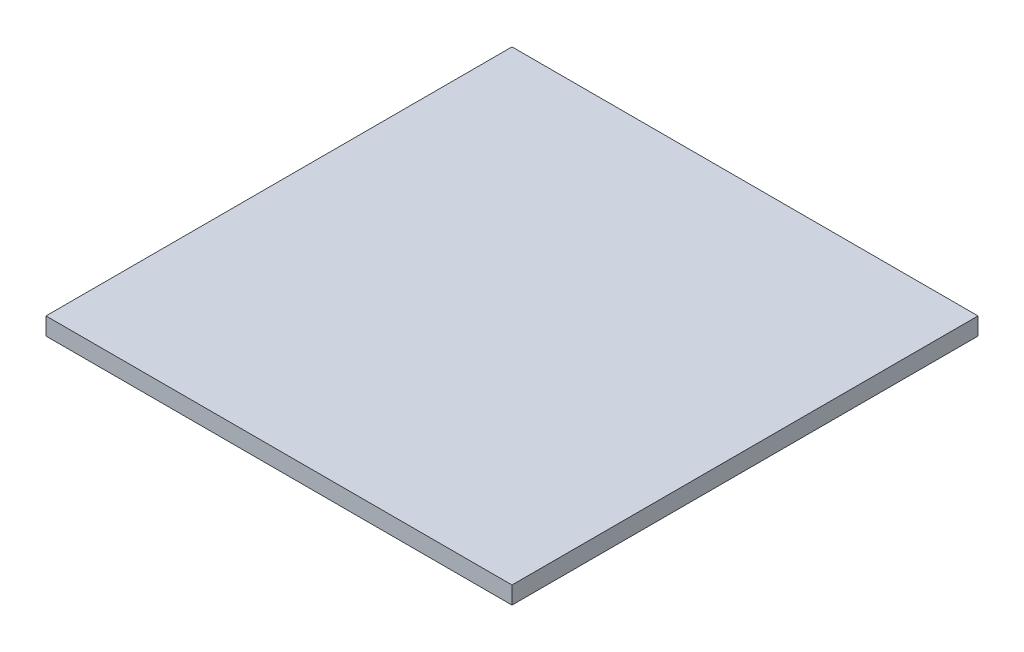
ISO-10303-21;
HEADER;
FILE_DESCRIPTION(('STEP AP214'),'2;1');
FILE_NAME('part.step','',(''),(''),'','','');
FILE_SCHEMA(('AUTOMOTIVE_DESIGN { 1 0 10303 214 1 1 1 1 }'));
ENDSEC;
DATA;
#1=APPLICATION_CONTEXT('core data for automotive mechanical design processes');
#2=APPLICATION_PROTOCOL_DEFINITION('international standard','automotive_design',2000,#1);
#3=PRODUCT_CONTEXT('',#1,'mechanical');
#4=PRODUCT('Part','Part','',(#3));
#5=PRODUCT_RELATED_PRODUCT_CATEGORY('part','',(#4));
#6=PRODUCT_DEFINITION_FORMATION('','',#4);
#7=PRODUCT_DEFINITION_CONTEXT('part definition',#1,'design');
#8=PRODUCT_DEFINITION('design','',#6,#7);
#9=PRODUCT_DEFINITION_SHAPE('','',#8);
#10=(LENGTH_UNIT() NAMED_UNIT(*) SI_UNIT(.MILLI.,.METRE.));
#11=(NAMED_UNIT(*) PLANE_ANGLE_UNIT() SI_UNIT($,.RADIAN.));
#12=(NAMED_UNIT(*) SI_UNIT($,.STERADIAN.) SOLID_ANGLE_UNIT());
#13=UNCERTAINTY_MEASURE_WITH_UNIT(LENGTH_MEASURE(1.E-05),#10,'distance_accuracy_value','');
#14=(GEOMETRIC_REPRESENTATION_CONTEXT(3) GLOBAL_UNCERTAINTY_ASSIGNED_CONTEXT((#13)) GLOBAL_UNIT_ASSIGNED_CONTEXT((#10,
#11,#12)) REPRESENTATION_CONTEXT('',''));
#15=CARTESIAN_POINT('',(0.,0.,0.));
#16=DIRECTION('',(0.,0.,1.));
#17=DIRECTION('',(1.,0.,0.));
#18=AXIS2_PLACEMENT_3D('',#15,#16,#17);
#19=CARTESIAN_POINT('',(0.,15.,0.));
#20=DIRECTION('',(1.,0.,0.));
#21=DIRECTION('',(0.,0.,-1.));
#22=AXIS2_PLACEMENT_3D('',#19,#20,#21);
#23=PLANE('',#22);
#24=DIRECTION('',(0.,0.,1.));
#25=VECTOR('',#24,1.);
#26=CARTESIAN_POINT('',(0.,0.,0.));
#27=LINE('',#26,#25);
#28=CARTESIAN_POINT('',(0.,0.,-400.));
#29=VERTEX_POINT('',#28);
#30=CARTESIAN_POINT('',(0.,0.,0.));
#31=VERTEX_POINT('',#30);
#32=EDGE_CURVE('E98',#29,#31,#27,.T.);
#33=ORIENTED_EDGE('',*,*,#32,.T.);
#34=DIRECTION('',(0.,-1.,0.));
#35=VECTOR('',#34,1.);
#36=CARTESIAN_POINT('',(0.,15.,0.));
#37=LINE('',#36,#35);
#38=CARTESIAN_POINT('',(0.,15.,0.));
#39=VERTEX_POINT('',#38);
#40=EDGE_CURVE('E11',#39,#31,#37,.T.);
#41=ORIENTED_EDGE('',*,*,#40,.F.);
#42=DIRECTION('',(0.,0.,1.));
#43=VECTOR('',#42,1.);
#44=CARTESIAN_POINT('',(0.,15.,0.));
#45=LINE('',#44,#43);
#46=CARTESIAN_POINT('',(0.,15.,-400.));
#47=VERTEX_POINT('',#46);
#48=EDGE_CURVE('E86',#47,#39,#45,.T.);
#49=ORIENTED_EDGE('',*,*,#48,.F.);
#50=DIRECTION('',(0.,-1.,0.));
#51=VECTOR('',#50,1.);
#52=CARTESIAN_POINT('',(0.,15.,-400.));
#53=LINE('',#52,#51);
#54=EDGE_CURVE('E94',#47,#29,#53,.T.);
#55=ORIENTED_EDGE('',*,*,#54,.T.);
#56=EDGE_LOOP('',(#33,#41,#49,#55));
#57=FACE_BOUND('',#56,.T.);
#58=ADVANCED_FACE('F35',(#57),#23,.F.);
#59=CARTESIAN_POINT('',(0.,15.,0.));
#60=DIRECTION('',(0.,0.,-1.));
#61=DIRECTION('',(-1.,0.,0.));
#62=AXIS2_PLACEMENT_3D('',#59,#60,#61);
#63=PLANE('',#62);
#64=DIRECTION('',(1.,0.,0.));
#65=VECTOR('',#64,1.);
#66=CARTESIAN_POINT('',(0.,0.,0.));
#67=LINE('',#66,#65);
#68=CARTESIAN_POINT('',(400.,0.,0.));
#69=VERTEX_POINT('',#68);
#70=EDGE_CURVE('E90',#31,#69,#67,.T.);
#71=ORIENTED_EDGE('',*,*,#70,.T.);
#72=DIRECTION('',(0.,-1.,0.));
#73=VECTOR('',#72,1.);
#74=CARTESIAN_POINT('',(400.,15.,0.));
#75=LINE('',#74,#73);
#76=CARTESIAN_POINT('',(400.,15.,0.));
#77=VERTEX_POINT('',#76);
#78=EDGE_CURVE('E43',#77,#69,#75,.T.);
#79=ORIENTED_EDGE('',*,*,#78,.F.);
#80=DIRECTION('',(1.,0.,0.));
#81=VECTOR('',#80,1.);
#82=CARTESIAN_POINT('',(0.,15.,0.));
#83=LINE('',#82,#81);
#84=EDGE_CURVE('E81',#39,#77,#83,.T.);
#85=ORIENTED_EDGE('',*,*,#84,.F.);
#86=ORIENTED_EDGE('',*,*,#40,.T.);
#87=EDGE_LOOP('',(#71,#79,#85,#86));
#88=FACE_BOUND('',#87,.T.);
#89=ADVANCED_FACE('F89',(#88),#63,.F.);
#90=CARTESIAN_POINT('',(400.,15.,0.));
#91=DIRECTION('',(-1.,0.,0.));
#92=DIRECTION('',(0.,0.,1.));
#93=AXIS2_PLACEMENT_3D('',#90,#91,#92);
#94=PLANE('',#93);
#95=DIRECTION('',(0.,0.,-1.));
#96=VECTOR('',#95,1.);
#97=CARTESIAN_POINT('',(400.,0.,0.));
#98=LINE('',#97,#96);
#99=CARTESIAN_POINT('',(400.,0.,-400.));
#100=VERTEX_POINT('',#99);
#101=EDGE_CURVE('E68',#69,#100,#98,.T.);
#102=ORIENTED_EDGE('',*,*,#101,.T.);
#103=DIRECTION('',(0.,-1.,0.));
#104=VECTOR('',#103,1.);
#105=CARTESIAN_POINT('',(400.,15.,-400.));
#106=LINE('',#105,#104);
#107=CARTESIAN_POINT('',(400.,15.,-400.));
#108=VERTEX_POINT('',#107);
#109=EDGE_CURVE('E91',#108,#100,#106,.T.);
#110=ORIENTED_EDGE('',*,*,#109,.F.);
#111=DIRECTION('',(0.,0.,-1.));
#112=VECTOR('',#111,1.);
#113=CARTESIAN_POINT('',(400.,15.,0.));
#114=LINE('',#113,#112);
#115=EDGE_CURVE('E84',#77,#108,#114,.T.);
#116=ORIENTED_EDGE('',*,*,#115,.F.);
#117=ORIENTED_EDGE('',*,*,#78,.T.);
#118=EDGE_LOOP('',(#102,#110,#116,#117));
#119=FACE_BOUND('',#118,.T.);
#120=ADVANCED_FACE('F92',(#119),#94,.F.);
#121=CARTESIAN_POINT('',(0.,15.,-400.));
#122=DIRECTION('',(0.,0.,1.));
#123=DIRECTION('',(1.,0.,0.));
#124=AXIS2_PLACEMENT_3D('',#121,#122,#123);
#125=PLANE('',#124);
#126=DIRECTION('',(-1.,0.,0.));
#127=VECTOR('',#126,1.);
#128=CARTESIAN_POINT('',(0.,0.,-400.));
#129=LINE('',#128,#127);
#130=EDGE_CURVE('E74',#100,#29,#129,.T.);
#131=ORIENTED_EDGE('',*,*,#130,.T.);
#132=ORIENTED_EDGE('',*,*,#54,.F.);
#133=DIRECTION('',(-1.,0.,0.));
#134=VECTOR('',#133,1.);
#135=CARTESIAN_POINT('',(0.,15.,-400.));
#136=LINE('',#135,#134);
#137=EDGE_CURVE('E51',#108,#47,#136,.T.);
#138=ORIENTED_EDGE('',*,*,#137,.F.);
#139=ORIENTED_EDGE('',*,*,#109,.T.);
#140=EDGE_LOOP('',(#131,#132,#138,#139));
#141=FACE_BOUND('',#140,.T.);
#142=ADVANCED_FACE('F105',(#141),#125,.F.);
#143=CARTESIAN_POINT('',(0.,15.,0.));
#144=DIRECTION('',(0.,-1.,0.));
#145=DIRECTION('',(0.,0.,-1.));
#146=AXIS2_PLACEMENT_3D('',#143,#144,#145);
#147=PLANE('',#146);
#148=ORIENTED_EDGE('',*,*,#48,.T.);
#149=ORIENTED_EDGE('',*,*,#84,.T.);
#150=ORIENTED_EDGE('',*,*,#115,.T.);
#151=ORIENTED_EDGE('',*,*,#137,.T.);
#152=EDGE_LOOP('',(#148,#149,#150,#151));
#153=FACE_BOUND('',#152,.T.);
#154=ADVANCED_FACE('F82',(#153),#147,.F.);
#155=CARTESIAN_POINT('',(0.,0.,0.));
#156=DIRECTION('',(0.,-1.,0.));
#157=DIRECTION('',(0.,0.,-1.));
#158=AXIS2_PLACEMENT_3D('',#155,#156,#157);
#159=PLANE('',#158);
#160=ORIENTED_EDGE('',*,*,#32,.F.);
#161=ORIENTED_EDGE('',*,*,#130,.F.);
#162=ORIENTED_EDGE('',*,*,#101,.F.);
#163=ORIENTED_EDGE('',*,*,#70,.F.);
#164=EDGE_LOOP('',(#160,#161,#162,#163));
#165=FACE_BOUND('',#164,.T.);
#166=ADVANCED_FACE('F108',(#165),#159,.T.);
#167=CLOSED_SHELL('',(#58,#89,#120,#142,#154,#166));
#168=MANIFOLD_SOLID_BREP('B2',#167);
#169=ADVANCED_BREP_SHAPE_REPRESENTATION('',(#18,#168),#14);
#170=SHAPE_DEFINITION_REPRESENTATION(#9,#169);
ENDSEC;
END-ISO-10303-21;
